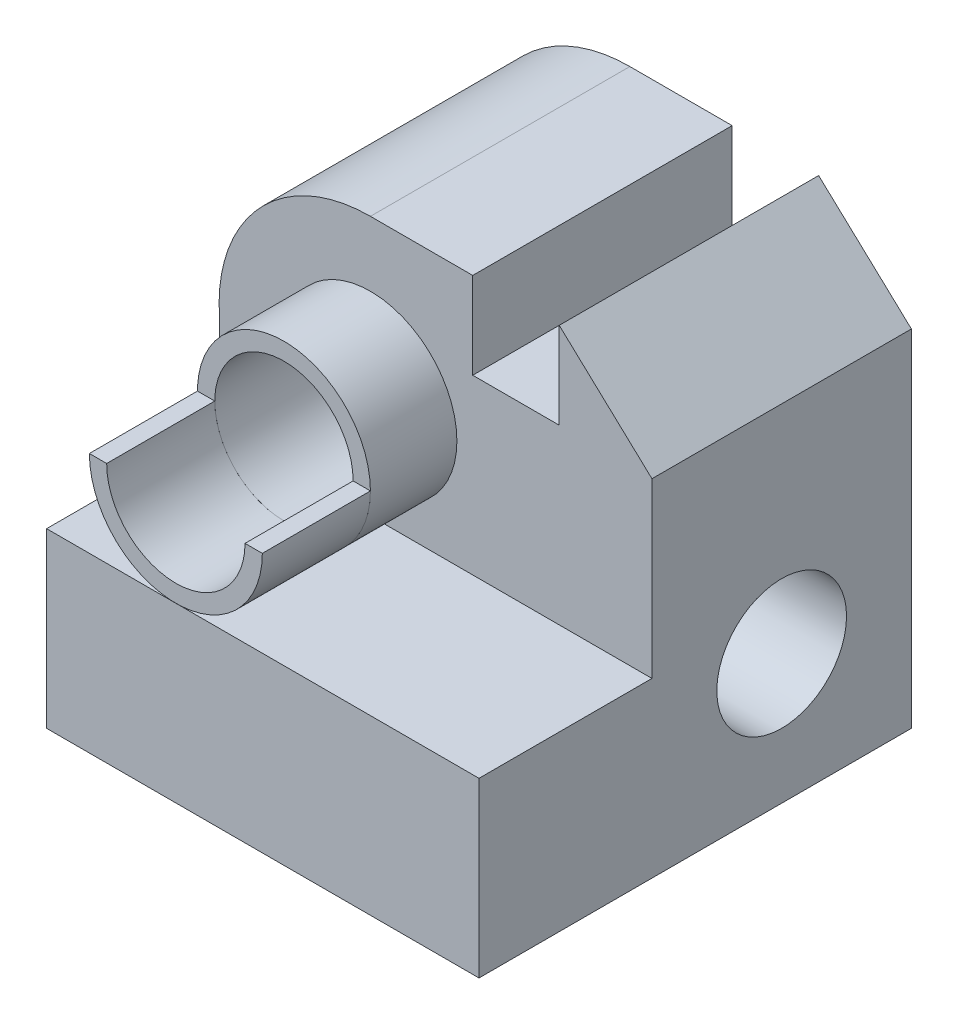
ISO-10303-21;
HEADER;
FILE_DESCRIPTION(('STEP AP214'),'2;1');
FILE_NAME('part.step','',(''),(''),'','','');
FILE_SCHEMA(('AUTOMOTIVE_DESIGN { 1 0 10303 214 1 1 1 1 }'));
ENDSEC;
DATA;
#1=APPLICATION_CONTEXT('core data for automotive mechanical design processes');
#2=APPLICATION_PROTOCOL_DEFINITION('international standard','automotive_design',2000,#1);
#3=PRODUCT_CONTEXT('',#1,'mechanical');
#4=PRODUCT('Part','Part','',(#3));
#5=PRODUCT_RELATED_PRODUCT_CATEGORY('part','',(#4));
#6=PRODUCT_DEFINITION_FORMATION('','',#4);
#7=PRODUCT_DEFINITION_CONTEXT('part definition',#1,'design');
#8=PRODUCT_DEFINITION('design','',#6,#7);
#9=PRODUCT_DEFINITION_SHAPE('','',#8);
#10=(LENGTH_UNIT() NAMED_UNIT(*) SI_UNIT(.MILLI.,.METRE.));
#11=(NAMED_UNIT(*) PLANE_ANGLE_UNIT() SI_UNIT($,.RADIAN.));
#12=(NAMED_UNIT(*) SI_UNIT($,.STERADIAN.) SOLID_ANGLE_UNIT());
#13=UNCERTAINTY_MEASURE_WITH_UNIT(LENGTH_MEASURE(1.E-05),#10,'distance_accuracy_value','');
#14=(GEOMETRIC_REPRESENTATION_CONTEXT(3) GLOBAL_UNCERTAINTY_ASSIGNED_CONTEXT((#13)) GLOBAL_UNIT_ASSIGNED_CONTEXT((#10,
#11,#12)) REPRESENTATION_CONTEXT('',''));
#15=CARTESIAN_POINT('',(0.,0.,0.));
#16=DIRECTION('',(0.,0.,1.));
#17=DIRECTION('',(1.,0.,0.));
#18=AXIS2_PLACEMENT_3D('',#15,#16,#17);
#19=CARTESIAN_POINT('',(-1.4658413372004E-13,41.275,3.175));
#20=DIRECTION('',(0.,1.,0.));
#21=DIRECTION('',(-1.,0.,0.));
#22=AXIS2_PLACEMENT_3D('',#19,#20,#21);
#23=PLANE('',#22);
#24=DIRECTION('',(1.,0.,0.));
#25=VECTOR('',#24,1.);
#26=CARTESIAN_POINT('',(-1.4658413372004E-13,41.275,-12.7));
#27=LINE('',#26,#25);
#28=CARTESIAN_POINT('',(-16.4989070502014,41.2749999999999,-12.7));
#29=VERTEX_POINT('',#28);
#30=CARTESIAN_POINT('',(-13.9589070502014,41.2749999999999,-12.7));
#31=VERTEX_POINT('',#30);
#32=EDGE_CURVE('E115',#29,#31,#27,.T.);
#33=ORIENTED_EDGE('',*,*,#32,.F.);
#34=DIRECTION('',(0.,0.,-1.));
#35=VECTOR('',#34,1.);
#36=CARTESIAN_POINT('',(-16.4989070502014,41.2749999999999,3.175));
#37=LINE('',#36,#35);
#38=CARTESIAN_POINT('',(-16.4989070502014,41.2749999999999,3.175));
#39=VERTEX_POINT('',#38);
#40=EDGE_CURVE('E12',#39,#29,#37,.T.);
#41=ORIENTED_EDGE('',*,*,#40,.F.);
#42=DIRECTION('',(1.,0.,0.));
#43=VECTOR('',#42,1.);
#44=CARTESIAN_POINT('',(-1.4658413372004E-13,41.275,3.175));
#45=LINE('',#44,#43);
#46=CARTESIAN_POINT('',(-13.9589070502014,41.2749999999999,3.175));
#47=VERTEX_POINT('',#46);
#48=EDGE_CURVE('E98',#39,#47,#45,.T.);
#49=ORIENTED_EDGE('',*,*,#48,.T.);
#50=DIRECTION('',(0.,0.,-1.));
#51=VECTOR('',#50,1.);
#52=CARTESIAN_POINT('',(-13.9589070502014,41.2749999999999,3.175));
#53=LINE('',#52,#51);
#54=EDGE_CURVE('E88',#47,#31,#53,.T.);
#55=ORIENTED_EDGE('',*,*,#54,.T.);
#56=EDGE_LOOP('',(#33,#41,#49,#55));
#57=FACE_BOUND('',#56,.T.);
#58=ADVANCED_FACE('F49',(#57),#23,.T.);
#59=CARTESIAN_POINT('',(-3.79890705020145,41.275,3.175));
#60=DIRECTION('',(0.,0.,-1.));
#61=DIRECTION('',(-1.,0.,0.));
#62=AXIS2_PLACEMENT_3D('',#59,#60,#61);
#63=CYLINDRICAL_SURFACE('',#62,12.7);
#64=CARTESIAN_POINT('',(-3.79890705020145,41.275,-12.7));
#65=DIRECTION('',(0.,0.,1.));
#66=DIRECTION('',(1.,0.,0.));
#67=AXIS2_PLACEMENT_3D('',#64,#65,#66);
#68=CIRCLE('',#67,12.7);
#69=CARTESIAN_POINT('',(8.90109294979855,41.275,-12.7));
#70=VERTEX_POINT('',#69);
#71=EDGE_CURVE('E103',#29,#70,#68,.T.);
#72=ORIENTED_EDGE('',*,*,#71,.T.);
#73=DIRECTION('',(0.,0.,-1.));
#74=VECTOR('',#73,1.);
#75=CARTESIAN_POINT('',(8.90109294979855,41.275,3.175));
#76=LINE('',#75,#74);
#77=CARTESIAN_POINT('',(8.90109294979855,41.275,3.175));
#78=VERTEX_POINT('',#77);
#79=EDGE_CURVE('E58',#78,#70,#76,.T.);
#80=ORIENTED_EDGE('',*,*,#79,.F.);
#81=CARTESIAN_POINT('',(-3.79890705020145,41.275,3.175));
#82=DIRECTION('',(0.,0.,1.));
#83=DIRECTION('',(1.,0.,0.));
#84=AXIS2_PLACEMENT_3D('',#81,#82,#83);
#85=CIRCLE('',#84,12.7);
#86=EDGE_CURVE('E93',#39,#78,#85,.T.);
#87=ORIENTED_EDGE('',*,*,#86,.F.);
#88=ORIENTED_EDGE('',*,*,#40,.T.);
#89=EDGE_LOOP('',(#72,#80,#87,#88));
#90=FACE_BOUND('',#89,.T.);
#91=ADVANCED_FACE('F51',(#90),#63,.T.);
#92=CARTESIAN_POINT('',(6.36109294979855,41.275,-12.7));
#93=VERTEX_POINT('',#92);
#94=EDGE_CURVE('E111',#93,#70,#27,.T.);
#95=ORIENTED_EDGE('',*,*,#94,.F.);
#96=DIRECTION('',(0.,0.,-1.));
#97=VECTOR('',#96,1.);
#98=CARTESIAN_POINT('',(6.36109294979855,41.275,3.175));
#99=LINE('',#98,#97);
#100=CARTESIAN_POINT('',(6.36109294979855,41.275,3.175));
#101=VERTEX_POINT('',#100);
#102=EDGE_CURVE('E81',#101,#93,#99,.T.);
#103=ORIENTED_EDGE('',*,*,#102,.F.);
#104=EDGE_CURVE('E97',#101,#78,#45,.T.);
#105=ORIENTED_EDGE('',*,*,#104,.T.);
#106=ORIENTED_EDGE('',*,*,#79,.T.);
#107=EDGE_LOOP('',(#95,#103,#105,#106));
#108=FACE_BOUND('',#107,.T.);
#109=ADVANCED_FACE('F107',(#108),#23,.T.);
#110=CARTESIAN_POINT('',(-3.79890705020145,41.275,3.175));
#111=DIRECTION('',(0.,0.,-1.));
#112=DIRECTION('',(-1.,0.,0.));
#113=AXIS2_PLACEMENT_3D('',#110,#111,#112);
#114=CYLINDRICAL_SURFACE('',#113,10.16);
#115=CARTESIAN_POINT('',(-3.79890705020145,41.275,-12.7));
#116=DIRECTION('',(0.,0.,1.));
#117=DIRECTION('',(1.,0.,0.));
#118=AXIS2_PLACEMENT_3D('',#115,#116,#117);
#119=CIRCLE('',#118,10.16);
#120=EDGE_CURVE('E110',#93,#31,#119,.F.);
#121=ORIENTED_EDGE('',*,*,#120,.T.);
#122=ORIENTED_EDGE('',*,*,#54,.F.);
#123=CARTESIAN_POINT('',(-3.79890705020145,41.275,3.175));
#124=DIRECTION('',(0.,0.,1.));
#125=DIRECTION('',(1.,0.,0.));
#126=AXIS2_PLACEMENT_3D('',#123,#124,#125);
#127=CIRCLE('',#126,10.16);
#128=EDGE_CURVE('E66',#101,#47,#127,.F.);
#129=ORIENTED_EDGE('',*,*,#128,.F.);
#130=ORIENTED_EDGE('',*,*,#102,.T.);
#131=EDGE_LOOP('',(#121,#122,#129,#130));
#132=FACE_BOUND('',#131,.T.);
#133=ADVANCED_FACE('F127',(#132),#114,.F.);
#134=CARTESIAN_POINT('',(0.,0.,3.175));
#135=DIRECTION('',(0.,0.,1.));
#136=DIRECTION('',(1.,0.,0.));
#137=AXIS2_PLACEMENT_3D('',#134,#135,#136);
#138=PLANE('',#137);
#139=ORIENTED_EDGE('',*,*,#48,.F.);
#140=ORIENTED_EDGE('',*,*,#86,.T.);
#141=ORIENTED_EDGE('',*,*,#104,.F.);
#142=ORIENTED_EDGE('',*,*,#128,.T.);
#143=EDGE_LOOP('',(#139,#140,#141,#142));
#144=FACE_BOUND('',#143,.T.);
#145=ADVANCED_FACE('F95',(#144),#138,.T.);
#146=CARTESIAN_POINT('',(0.,0.,-12.7));
#147=DIRECTION('',(0.,0.,1.));
#148=DIRECTION('',(1.,0.,0.));
#149=AXIS2_PLACEMENT_3D('',#146,#147,#148);
#150=PLANE('',#149);
#151=ORIENTED_EDGE('',*,*,#32,.T.);
#152=ORIENTED_EDGE('',*,*,#120,.F.);
#153=ORIENTED_EDGE('',*,*,#94,.T.);
#154=ORIENTED_EDGE('',*,*,#71,.F.);
#155=EDGE_LOOP('',(#151,#152,#153,#154));
#156=FACE_BOUND('',#155,.T.);
#157=ADVANCED_FACE('F120',(#156),#150,.F.);
#158=CLOSED_SHELL('',(#58,#91,#109,#133,#145,#157));
#159=MANIFOLD_SOLID_BREP('B2',#158);
#160=CARTESIAN_POINT('',(37.5469011725293,25.4,-63.5));
#161=DIRECTION('',(0.,1.,0.));
#162=DIRECTION('',(-1.,0.,0.));
#163=AXIS2_PLACEMENT_3D('',#160,#161,#162);
#164=PLANE('',#163);
#165=DIRECTION('',(0.,0.,1.));
#166=VECTOR('',#165,1.);
#167=CARTESIAN_POINT('',(37.5469011725293,25.4,-63.5));
#168=LINE('',#167,#166);
#169=CARTESIAN_POINT('',(37.5469011725293,25.4,-25.4));
#170=VERTEX_POINT('',#169);
#171=CARTESIAN_POINT('',(37.5469011725293,25.4,0.));
#172=VERTEX_POINT('',#171);
#173=EDGE_CURVE('E197',#170,#172,#168,.T.);
#174=ORIENTED_EDGE('',*,*,#173,.F.);
#175=DIRECTION('',(-1.,0.,0.));
#176=VECTOR('',#175,1.);
#177=CARTESIAN_POINT('',(37.5469011725293,25.4,-25.4));
#178=LINE('',#177,#176);
#179=CARTESIAN_POINT('',(-25.9530988274707,25.4,-25.4));
#180=VERTEX_POINT('',#179);
#181=EDGE_CURVE('E236',#170,#180,#178,.T.);
#182=ORIENTED_EDGE('',*,*,#181,.T.);
#183=DIRECTION('',(0.,0.,1.));
#184=VECTOR('',#183,1.);
#185=CARTESIAN_POINT('',(-25.9530988274707,25.4,-63.5));
#186=LINE('',#185,#184);
#187=CARTESIAN_POINT('',(-25.9530988274707,25.4,0.));
#188=VERTEX_POINT('',#187);
#189=EDGE_CURVE('E47',#180,#188,#186,.T.);
#190=ORIENTED_EDGE('',*,*,#189,.T.);
#191=DIRECTION('',(-1.,0.,0.));
#192=VECTOR('',#191,1.);
#193=CARTESIAN_POINT('',(37.5469011725293,25.4,0.));
#194=LINE('',#193,#192);
#195=EDGE_CURVE('E235',#172,#188,#194,.T.);
#196=ORIENTED_EDGE('',*,*,#195,.F.);
#197=EDGE_LOOP('',(#174,#182,#190,#196));
#198=FACE_BOUND('',#197,.T.);
#199=ADVANCED_FACE('F188',(#198),#164,.T.);
#200=CARTESIAN_POINT('',(-25.9530988274707,25.4,-63.5));
#201=DIRECTION('',(-1.,0.,0.));
#202=DIRECTION('',(0.,-1.,0.));
#203=AXIS2_PLACEMENT_3D('',#200,#201,#202);
#204=PLANE('',#203);
#205=CARTESIAN_POINT('',(-25.9530988274707,19.05,-44.45));
#206=DIRECTION('',(-1.,0.,0.));
#207=DIRECTION('',(0.,-1.,0.));
#208=AXIS2_PLACEMENT_3D('',#205,#206,#207);
#209=CIRCLE('',#208,9.525);
#210=CARTESIAN_POINT('',(-25.9530988274707,9.525,-44.45));
#211=VERTEX_POINT('',#210);
#212=EDGE_CURVE('E393',#211,#211,#209,.T.);
#213=ORIENTED_EDGE('',*,*,#212,.F.);
#214=EDGE_LOOP('',(#213));
#215=FACE_BOUND('',#214,.T.);
#216=DIRECTION('',(0.,-1.,0.));
#217=VECTOR('',#216,1.);
#218=CARTESIAN_POINT('',(-25.9530988274707,25.4,0.));
#219=LINE('',#218,#217);
#220=CARTESIAN_POINT('',(-25.9530988274707,0.,0.));
#221=VERTEX_POINT('',#220);
#222=EDGE_CURVE('E239',#188,#221,#219,.T.);
#223=ORIENTED_EDGE('',*,*,#222,.F.);
#224=ORIENTED_EDGE('',*,*,#189,.F.);
#225=DIRECTION('',(0.,1.,0.));
#226=VECTOR('',#225,1.);
#227=CARTESIAN_POINT('',(-25.9530988274707,25.4,-25.4));
#228=LINE('',#227,#226);
#229=CARTESIAN_POINT('',(-25.9530988274707,39.5023151165603,-25.4));
#230=VERTEX_POINT('',#229);
#231=EDGE_CURVE('E205',#180,#230,#228,.T.);
#232=ORIENTED_EDGE('',*,*,#231,.T.);
#233=DIRECTION('',(0.,0.,-1.));
#234=VECTOR('',#233,1.);
#235=CARTESIAN_POINT('',(-25.9530988274707,39.5023151165603,-25.4));
#236=LINE('',#235,#234);
#237=CARTESIAN_POINT('',(-25.9530988274707,39.5023151165603,-63.5));
#238=VERTEX_POINT('',#237);
#239=EDGE_CURVE('E275',#230,#238,#236,.T.);
#240=ORIENTED_EDGE('',*,*,#239,.T.);
#241=DIRECTION('',(0.,-1.,0.));
#242=VECTOR('',#241,1.);
#243=CARTESIAN_POINT('',(-25.9530988274707,25.4,-63.5));
#244=LINE('',#243,#242);
#245=CARTESIAN_POINT('',(-25.9530988274707,0.,-63.5));
#246=VERTEX_POINT('',#245);
#247=EDGE_CURVE('E250',#238,#246,#244,.T.);
#248=ORIENTED_EDGE('',*,*,#247,.T.);
#249=DIRECTION('',(0.,0.,1.));
#250=VECTOR('',#249,1.);
#251=CARTESIAN_POINT('',(-25.9530988274707,0.,-63.5));
#252=LINE('',#251,#250);
#253=EDGE_CURVE('E192',#246,#221,#252,.T.);
#254=ORIENTED_EDGE('',*,*,#253,.T.);
#255=EDGE_LOOP('',(#223,#224,#232,#240,#248,#254));
#256=FACE_BOUND('',#255,.T.);
#257=ADVANCED_FACE('F190',(#215,#256),#204,.T.);
#258=CARTESIAN_POINT('',(37.5469011725293,0.,-63.5));
#259=DIRECTION('',(1.,0.,0.));
#260=DIRECTION('',(0.,0.,-1.));
#261=AXIS2_PLACEMENT_3D('',#258,#259,#260);
#262=PLANE('',#261);
#263=CARTESIAN_POINT('',(37.5469011725293,19.05,-44.45));
#264=DIRECTION('',(1.,0.,0.));
#265=DIRECTION('',(0.,0.,-1.));
#266=AXIS2_PLACEMENT_3D('',#263,#264,#265);
#267=CIRCLE('',#266,9.525);
#268=CARTESIAN_POINT('',(37.5469011725293,19.05,-53.975));
#269=VERTEX_POINT('',#268);
#270=EDGE_CURVE('E396',#269,#269,#267,.T.);
#271=ORIENTED_EDGE('',*,*,#270,.F.);
#272=EDGE_LOOP('',(#271));
#273=FACE_BOUND('',#272,.T.);
#274=DIRECTION('',(0.,1.,0.));
#275=VECTOR('',#274,1.);
#276=CARTESIAN_POINT('',(37.5469011725293,0.,0.));
#277=LINE('',#276,#275);
#278=CARTESIAN_POINT('',(37.5469011725293,0.,0.));
#279=VERTEX_POINT('',#278);
#280=EDGE_CURVE('E249',#279,#172,#277,.T.);
#281=ORIENTED_EDGE('',*,*,#280,.F.);
#282=DIRECTION('',(0.,0.,1.));
#283=VECTOR('',#282,1.);
#284=CARTESIAN_POINT('',(37.5469011725293,0.,-63.5));
#285=LINE('',#284,#283);
#286=CARTESIAN_POINT('',(37.5469011725293,0.,-63.5));
#287=VERTEX_POINT('',#286);
#288=EDGE_CURVE('E214',#287,#279,#285,.T.);
#289=ORIENTED_EDGE('',*,*,#288,.F.);
#290=DIRECTION('',(0.,1.,0.));
#291=VECTOR('',#290,1.);
#292=CARTESIAN_POINT('',(37.5469011725293,0.,-63.5));
#293=LINE('',#292,#291);
#294=CARTESIAN_POINT('',(37.5469011725293,50.8,-63.5));
#295=VERTEX_POINT('',#294);
#296=EDGE_CURVE('E259',#287,#295,#293,.T.);
#297=ORIENTED_EDGE('',*,*,#296,.T.);
#298=DIRECTION('',(0.,0.,-1.));
#299=VECTOR('',#298,1.);
#300=CARTESIAN_POINT('',(37.5469011725293,50.8,-25.4));
#301=LINE('',#300,#299);
#302=CARTESIAN_POINT('',(37.5469011725293,50.8,-25.4));
#303=VERTEX_POINT('',#302);
#304=EDGE_CURVE('E245',#303,#295,#301,.T.);
#305=ORIENTED_EDGE('',*,*,#304,.F.);
#306=DIRECTION('',(0.,-1.,0.));
#307=VECTOR('',#306,1.);
#308=CARTESIAN_POINT('',(37.5469011725293,25.4,-25.4));
#309=LINE('',#308,#307);
#310=EDGE_CURVE('E283',#303,#170,#309,.T.);
#311=ORIENTED_EDGE('',*,*,#310,.T.);
#312=ORIENTED_EDGE('',*,*,#173,.T.);
#313=EDGE_LOOP('',(#281,#289,#297,#305,#311,#312));
#314=FACE_BOUND('',#313,.T.);
#315=ADVANCED_FACE('F368',(#273,#314),#262,.T.);
#316=CARTESIAN_POINT('',(-25.9530988274707,0.,-63.5));
#317=DIRECTION('',(0.,-1.,0.));
#318=DIRECTION('',(0.,0.,-1.));
#319=AXIS2_PLACEMENT_3D('',#316,#317,#318);
#320=PLANE('',#319);
#321=DIRECTION('',(1.,0.,0.));
#322=VECTOR('',#321,1.);
#323=CARTESIAN_POINT('',(-25.9530988274707,0.,0.));
#324=LINE('',#323,#322);
#325=EDGE_CURVE('E244',#221,#279,#324,.T.);
#326=ORIENTED_EDGE('',*,*,#325,.F.);
#327=ORIENTED_EDGE('',*,*,#253,.F.);
#328=DIRECTION('',(1.,0.,0.));
#329=VECTOR('',#328,1.);
#330=CARTESIAN_POINT('',(-25.9530988274707,0.,-63.5));
#331=LINE('',#330,#329);
#332=EDGE_CURVE('E252',#246,#287,#331,.T.);
#333=ORIENTED_EDGE('',*,*,#332,.T.);
#334=ORIENTED_EDGE('',*,*,#288,.T.);
#335=EDGE_LOOP('',(#326,#327,#333,#334));
#336=FACE_BOUND('',#335,.T.);
#337=ADVANCED_FACE('F265',(#336),#320,.T.);
#338=CARTESIAN_POINT('',(0.,0.,-63.5));
#339=DIRECTION('',(0.,0.,1.));
#340=DIRECTION('',(1.,0.,0.));
#341=AXIS2_PLACEMENT_3D('',#338,#339,#340);
#342=PLANE('',#341);
#343=CARTESIAN_POINT('',(-3.79890705020145,41.275,-63.5));
#344=DIRECTION('',(0.,0.,1.));
#345=DIRECTION('',(1.,0.,0.));
#346=AXIS2_PLACEMENT_3D('',#343,#344,#345);
#347=CIRCLE('',#346,10.16);
#348=CARTESIAN_POINT('',(6.36109294979855,41.275,-63.5));
#349=VERTEX_POINT('',#348);
#350=EDGE_CURVE('E387',#349,#349,#347,.T.);
#351=ORIENTED_EDGE('',*,*,#350,.T.);
#352=EDGE_LOOP('',(#351));
#353=FACE_BOUND('',#352,.T.);
#354=ORIENTED_EDGE('',*,*,#247,.F.);
#355=CARTESIAN_POINT('',(-3.79890705020145,41.275,-63.5));
#356=DIRECTION('',(0.,0.,-1.));
#357=DIRECTION('',(1.,0.,0.));
#358=AXIS2_PLACEMENT_3D('',#355,#356,#357);
#359=CIRCLE('',#358,22.225);
#360=CARTESIAN_POINT('',(-3.79890705020145,63.5,-63.5));
#361=VERTEX_POINT('',#360);
#362=EDGE_CURVE('E286',#238,#361,#359,.T.);
#363=ORIENTED_EDGE('',*,*,#362,.T.);
#364=DIRECTION('',(1.,0.,0.));
#365=VECTOR('',#364,1.);
#366=CARTESIAN_POINT('',(11.2278185552158,63.5,-63.5));
#367=LINE('',#366,#365);
#368=CARTESIAN_POINT('',(11.2278185552158,63.5,-63.5));
#369=VERTEX_POINT('',#368);
#370=EDGE_CURVE('E291',#361,#369,#367,.T.);
#371=ORIENTED_EDGE('',*,*,#370,.T.);
#372=DIRECTION('',(0.,-1.,0.));
#373=VECTOR('',#372,1.);
#374=CARTESIAN_POINT('',(11.2278185552158,50.8,-63.5));
#375=LINE('',#374,#373);
#376=CARTESIAN_POINT('',(11.2278185552158,50.8,-63.5));
#377=VERTEX_POINT('',#376);
#378=EDGE_CURVE('E294',#369,#377,#375,.T.);
#379=ORIENTED_EDGE('',*,*,#378,.T.);
#380=DIRECTION('',(1.,0.,0.));
#381=VECTOR('',#380,1.);
#382=CARTESIAN_POINT('',(23.9278185552158,50.8,-63.5));
#383=LINE('',#382,#381);
#384=CARTESIAN_POINT('',(23.9278185552158,50.8,-63.5));
#385=VERTEX_POINT('',#384);
#386=EDGE_CURVE('E304',#377,#385,#383,.T.);
#387=ORIENTED_EDGE('',*,*,#386,.T.);
#388=DIRECTION('',(0.,1.,0.));
#389=VECTOR('',#388,1.);
#390=CARTESIAN_POINT('',(23.9278185552158,63.5,-63.5));
#391=LINE('',#390,#389);
#392=CARTESIAN_POINT('',(23.9278185552158,63.5,-63.5));
#393=VERTEX_POINT('',#392);
#394=EDGE_CURVE('E307',#385,#393,#391,.T.);
#395=ORIENTED_EDGE('',*,*,#394,.T.);
#396=DIRECTION('',(0.731353701619172,-0.681998360062497,0.));
#397=VECTOR('',#396,1.);
#398=CARTESIAN_POINT('',(37.5469011725293,50.8,-63.5));
#399=LINE('',#398,#397);
#400=EDGE_CURVE('E310',#393,#295,#399,.T.);
#401=ORIENTED_EDGE('',*,*,#400,.T.);
#402=ORIENTED_EDGE('',*,*,#296,.F.);
#403=ORIENTED_EDGE('',*,*,#332,.F.);
#404=EDGE_LOOP('',(#354,#363,#371,#379,#387,#395,#401,#402,#403));
#405=FACE_BOUND('',#404,.T.);
#406=ADVANCED_FACE('F269',(#353,#405),#342,.F.);
#407=CARTESIAN_POINT('',(0.,0.,0.));
#408=DIRECTION('',(0.,0.,1.));
#409=DIRECTION('',(1.,0.,0.));
#410=AXIS2_PLACEMENT_3D('',#407,#408,#409);
#411=PLANE('',#410);
#412=ORIENTED_EDGE('',*,*,#222,.T.);
#413=ORIENTED_EDGE('',*,*,#325,.T.);
#414=ORIENTED_EDGE('',*,*,#280,.T.);
#415=ORIENTED_EDGE('',*,*,#195,.T.);
#416=EDGE_LOOP('',(#412,#413,#414,#415));
#417=FACE_BOUND('',#416,.T.);
#418=ADVANCED_FACE('F248',(#417),#411,.T.);
#419=CARTESIAN_POINT('',(37.5469011725293,50.8,-25.4));
#420=DIRECTION('',(0.681998360062497,0.731353701619172,0.));
#421=DIRECTION('',(-0.731353701619172,0.681998360062497,0.));
#422=AXIS2_PLACEMENT_3D('',#419,#420,#421);
#423=PLANE('',#422);
#424=ORIENTED_EDGE('',*,*,#400,.F.);
#425=DIRECTION('',(0.,0.,-1.));
#426=VECTOR('',#425,1.);
#427=CARTESIAN_POINT('',(23.9278185552158,63.5,-25.4));
#428=LINE('',#427,#426);
#429=CARTESIAN_POINT('',(23.9278185552158,63.5,-25.4));
#430=VERTEX_POINT('',#429);
#431=EDGE_CURVE('E313',#430,#393,#428,.T.);
#432=ORIENTED_EDGE('',*,*,#431,.F.);
#433=DIRECTION('',(0.731353701619172,-0.681998360062497,0.));
#434=VECTOR('',#433,1.);
#435=CARTESIAN_POINT('',(37.5469011725293,50.8,-25.4));
#436=LINE('',#435,#434);
#437=EDGE_CURVE('E370',#430,#303,#436,.T.);
#438=ORIENTED_EDGE('',*,*,#437,.T.);
#439=ORIENTED_EDGE('',*,*,#304,.T.);
#440=EDGE_LOOP('',(#424,#432,#438,#439));
#441=FACE_BOUND('',#440,.T.);
#442=ADVANCED_FACE('F416',(#441),#423,.T.);
#443=CARTESIAN_POINT('',(23.9278185552158,63.5,-25.4));
#444=DIRECTION('',(-1.,0.,0.));
#445=DIRECTION('',(0.,-1.,0.));
#446=AXIS2_PLACEMENT_3D('',#443,#444,#445);
#447=PLANE('',#446);
#448=ORIENTED_EDGE('',*,*,#394,.F.);
#449=DIRECTION('',(0.,0.,-1.));
#450=VECTOR('',#449,1.);
#451=CARTESIAN_POINT('',(23.9278185552158,50.8,-25.4));
#452=LINE('',#451,#450);
#453=CARTESIAN_POINT('',(23.9278185552158,50.8,-25.4));
#454=VERTEX_POINT('',#453);
#455=EDGE_CURVE('E316',#454,#385,#452,.T.);
#456=ORIENTED_EDGE('',*,*,#455,.F.);
#457=DIRECTION('',(0.,1.,0.));
#458=VECTOR('',#457,1.);
#459=CARTESIAN_POINT('',(23.9278185552158,63.5,-25.4));
#460=LINE('',#459,#458);
#461=EDGE_CURVE('E371',#454,#430,#460,.T.);
#462=ORIENTED_EDGE('',*,*,#461,.T.);
#463=ORIENTED_EDGE('',*,*,#431,.T.);
#464=EDGE_LOOP('',(#448,#456,#462,#463));
#465=FACE_BOUND('',#464,.T.);
#466=ADVANCED_FACE('F429',(#465),#447,.T.);
#467=CARTESIAN_POINT('',(23.9278185552158,50.8,-25.4));
#468=DIRECTION('',(0.,1.,0.));
#469=DIRECTION('',(0.,0.,1.));
#470=AXIS2_PLACEMENT_3D('',#467,#468,#469);
#471=PLANE('',#470);
#472=ORIENTED_EDGE('',*,*,#386,.F.);
#473=DIRECTION('',(0.,0.,-1.));
#474=VECTOR('',#473,1.);
#475=CARTESIAN_POINT('',(11.2278185552158,50.8,-25.4));
#476=LINE('',#475,#474);
#477=CARTESIAN_POINT('',(11.2278185552158,50.8,-25.4));
#478=VERTEX_POINT('',#477);
#479=EDGE_CURVE('E319',#478,#377,#476,.T.);
#480=ORIENTED_EDGE('',*,*,#479,.F.);
#481=DIRECTION('',(1.,0.,0.));
#482=VECTOR('',#481,1.);
#483=CARTESIAN_POINT('',(23.9278185552158,50.8,-25.4));
#484=LINE('',#483,#482);
#485=EDGE_CURVE('E374',#478,#454,#484,.T.);
#486=ORIENTED_EDGE('',*,*,#485,.T.);
#487=ORIENTED_EDGE('',*,*,#455,.T.);
#488=EDGE_LOOP('',(#472,#480,#486,#487));
#489=FACE_BOUND('',#488,.T.);
#490=ADVANCED_FACE('F426',(#489),#471,.T.);
#491=CARTESIAN_POINT('',(11.2278185552158,50.8,-25.4));
#492=DIRECTION('',(1.,0.,0.));
#493=DIRECTION('',(0.,0.,-1.));
#494=AXIS2_PLACEMENT_3D('',#491,#492,#493);
#495=PLANE('',#494);
#496=ORIENTED_EDGE('',*,*,#378,.F.);
#497=DIRECTION('',(0.,0.,-1.));
#498=VECTOR('',#497,1.);
#499=CARTESIAN_POINT('',(11.2278185552158,63.5,-25.4));
#500=LINE('',#499,#498);
#501=CARTESIAN_POINT('',(11.2278185552158,63.5,-25.4));
#502=VERTEX_POINT('',#501);
#503=EDGE_CURVE('E322',#502,#369,#500,.T.);
#504=ORIENTED_EDGE('',*,*,#503,.F.);
#505=DIRECTION('',(0.,-1.,0.));
#506=VECTOR('',#505,1.);
#507=CARTESIAN_POINT('',(11.2278185552158,50.8,-25.4));
#508=LINE('',#507,#506);
#509=EDGE_CURVE('E379',#502,#478,#508,.T.);
#510=ORIENTED_EDGE('',*,*,#509,.T.);
#511=ORIENTED_EDGE('',*,*,#479,.T.);
#512=EDGE_LOOP('',(#496,#504,#510,#511));
#513=FACE_BOUND('',#512,.T.);
#514=ADVANCED_FACE('F339',(#513),#495,.T.);
#515=CARTESIAN_POINT('',(11.2278185552158,63.5,-25.4));
#516=DIRECTION('',(0.,1.,0.));
#517=DIRECTION('',(0.,0.,1.));
#518=AXIS2_PLACEMENT_3D('',#515,#516,#517);
#519=PLANE('',#518);
#520=ORIENTED_EDGE('',*,*,#370,.F.);
#521=DIRECTION('',(0.,0.,-1.));
#522=VECTOR('',#521,1.);
#523=CARTESIAN_POINT('',(-3.79890705020145,63.5,-25.4));
#524=LINE('',#523,#522);
#525=CARTESIAN_POINT('',(-3.79890705020145,63.5,-25.4));
#526=VERTEX_POINT('',#525);
#527=EDGE_CURVE('E282',#526,#361,#524,.T.);
#528=ORIENTED_EDGE('',*,*,#527,.F.);
#529=DIRECTION('',(1.,0.,0.));
#530=VECTOR('',#529,1.);
#531=CARTESIAN_POINT('',(11.2278185552158,63.5,-25.4));
#532=LINE('',#531,#530);
#533=EDGE_CURVE('E333',#526,#502,#532,.T.);
#534=ORIENTED_EDGE('',*,*,#533,.T.);
#535=ORIENTED_EDGE('',*,*,#503,.T.);
#536=EDGE_LOOP('',(#520,#528,#534,#535));
#537=FACE_BOUND('',#536,.T.);
#538=ADVANCED_FACE('F330',(#537),#519,.T.);
#539=CARTESIAN_POINT('',(-3.79890705020145,41.275,-25.4));
#540=DIRECTION('',(0.,0.,-1.));
#541=DIRECTION('',(-1.,0.,0.));
#542=AXIS2_PLACEMENT_3D('',#539,#540,#541);
#543=CYLINDRICAL_SURFACE('',#542,22.225);
#544=ORIENTED_EDGE('',*,*,#362,.F.);
#545=ORIENTED_EDGE('',*,*,#239,.F.);
#546=CARTESIAN_POINT('',(-3.79890705020145,41.275,-25.4));
#547=DIRECTION('',(0.,0.,-1.));
#548=DIRECTION('',(1.,0.,0.));
#549=AXIS2_PLACEMENT_3D('',#546,#547,#548);
#550=CIRCLE('',#549,22.225);
#551=EDGE_CURVE('E382',#230,#526,#550,.T.);
#552=ORIENTED_EDGE('',*,*,#551,.T.);
#553=ORIENTED_EDGE('',*,*,#527,.T.);
#554=EDGE_LOOP('',(#544,#545,#552,#553));
#555=FACE_BOUND('',#554,.T.);
#556=ADVANCED_FACE('F287',(#555),#543,.T.);
#557=CARTESIAN_POINT('',(-3.79890705020145,41.275,-25.4));
#558=DIRECTION('',(0.,0.,1.));
#559=DIRECTION('',(1.,0.,0.));
#560=AXIS2_PLACEMENT_3D('',#557,#558,#559);
#561=PLANE('',#560);
#562=CARTESIAN_POINT('',(-3.79890705020145,41.275,-25.4));
#563=DIRECTION('',(0.,0.,1.));
#564=DIRECTION('',(1.,0.,0.));
#565=AXIS2_PLACEMENT_3D('',#562,#563,#564);
#566=CIRCLE('',#565,12.7);
#567=CARTESIAN_POINT('',(8.90109294979855,41.275,-25.4));
#568=VERTEX_POINT('',#567);
#569=EDGE_CURVE('E385',#568,#568,#566,.T.);
#570=ORIENTED_EDGE('',*,*,#569,.F.);
#571=EDGE_LOOP('',(#570));
#572=FACE_BOUND('',#571,.T.);
#573=ORIENTED_EDGE('',*,*,#181,.F.);
#574=ORIENTED_EDGE('',*,*,#310,.F.);
#575=ORIENTED_EDGE('',*,*,#437,.F.);
#576=ORIENTED_EDGE('',*,*,#461,.F.);
#577=ORIENTED_EDGE('',*,*,#485,.F.);
#578=ORIENTED_EDGE('',*,*,#509,.F.);
#579=ORIENTED_EDGE('',*,*,#533,.F.);
#580=ORIENTED_EDGE('',*,*,#551,.F.);
#581=ORIENTED_EDGE('',*,*,#231,.F.);
#582=EDGE_LOOP('',(#573,#574,#575,#576,#577,#578,#579,#580,#581));
#583=FACE_BOUND('',#582,.T.);
#584=ADVANCED_FACE('F365',(#572,#583),#561,.T.);
#585=CARTESIAN_POINT('',(-3.79890705020145,41.275,-12.7));
#586=DIRECTION('',(0.,0.,-1.));
#587=DIRECTION('',(-1.,0.,0.));
#588=AXIS2_PLACEMENT_3D('',#585,#586,#587);
#589=CYLINDRICAL_SURFACE('',#588,12.7);
#590=CARTESIAN_POINT('',(-3.79890705020145,41.275,-12.7));
#591=DIRECTION('',(0.,0.,1.));
#592=DIRECTION('',(1.,0.,0.));
#593=AXIS2_PLACEMENT_3D('',#590,#591,#592);
#594=CIRCLE('',#593,12.7);
#595=CARTESIAN_POINT('',(8.90109294979855,41.275,-12.7));
#596=VERTEX_POINT('',#595);
#597=EDGE_CURVE('E297',#596,#596,#594,.T.);
#598=ORIENTED_EDGE('',*,*,#597,.F.);
#599=EDGE_LOOP('',(#598));
#600=FACE_BOUND('',#599,.T.);
#601=ORIENTED_EDGE('',*,*,#569,.T.);
#602=EDGE_LOOP('',(#601));
#603=FACE_BOUND('',#602,.T.);
#604=ADVANCED_FACE('F438',(#600,#603),#589,.T.);
#605=CARTESIAN_POINT('',(-3.79890705020145,41.275,-12.7));
#606=DIRECTION('',(0.,0.,-1.));
#607=DIRECTION('',(-1.,0.,0.));
#608=AXIS2_PLACEMENT_3D('',#605,#606,#607);
#609=CYLINDRICAL_SURFACE('',#608,10.16);
#610=CARTESIAN_POINT('',(-3.79890705020145,41.275,-12.7));
#611=DIRECTION('',(0.,0.,1.));
#612=DIRECTION('',(1.,0.,0.));
#613=AXIS2_PLACEMENT_3D('',#610,#611,#612);
#614=CIRCLE('',#613,10.16);
#615=CARTESIAN_POINT('',(6.36109294979855,41.275,-12.7));
#616=VERTEX_POINT('',#615);
#617=EDGE_CURVE('E292',#616,#616,#614,.T.);
#618=ORIENTED_EDGE('',*,*,#617,.T.);
#619=EDGE_LOOP('',(#618));
#620=FACE_BOUND('',#619,.T.);
#621=ORIENTED_EDGE('',*,*,#350,.F.);
#622=EDGE_LOOP('',(#621));
#623=FACE_BOUND('',#622,.T.);
#624=ADVANCED_FACE('F442',(#620,#623),#609,.F.);
#625=CARTESIAN_POINT('',(0.,0.,-12.7));
#626=DIRECTION('',(0.,0.,1.));
#627=DIRECTION('',(1.,0.,0.));
#628=AXIS2_PLACEMENT_3D('',#625,#626,#627);
#629=PLANE('',#628);
#630=ORIENTED_EDGE('',*,*,#597,.T.);
#631=EDGE_LOOP('',(#630));
#632=FACE_BOUND('',#631,.T.);
#633=ORIENTED_EDGE('',*,*,#617,.F.);
#634=EDGE_LOOP('',(#633));
#635=FACE_BOUND('',#634,.T.);
#636=ADVANCED_FACE('F446',(#632,#635),#629,.T.);
#637=CARTESIAN_POINT('',(-26.0239070502014,19.05,-44.45));
#638=DIRECTION('',(1.,0.,0.));
#639=DIRECTION('',(0.,0.,-1.));
#640=AXIS2_PLACEMENT_3D('',#637,#638,#639);
#641=CYLINDRICAL_SURFACE('',#640,9.525);
#642=ORIENTED_EDGE('',*,*,#212,.T.);
#643=EDGE_LOOP('',(#642));
#644=FACE_BOUND('',#643,.T.);
#645=ORIENTED_EDGE('',*,*,#270,.T.);
#646=EDGE_LOOP('',(#645));
#647=FACE_BOUND('',#646,.T.);
#648=ADVANCED_FACE('F400',(#644,#647),#641,.F.);
#649=CLOSED_SHELL('',(#199,#257,#315,#337,#406,#418,#442,#466,#490,#514,#538,#556,#584,#604,
#624,#636,#648));
#650=MANIFOLD_SOLID_BREP('B6',#649);
#651=ADVANCED_BREP_SHAPE_REPRESENTATION('',(#18,#159,#650),#14);
#652=SHAPE_DEFINITION_REPRESENTATION(#9,#651);
ENDSEC;
END-ISO-10303-21;
